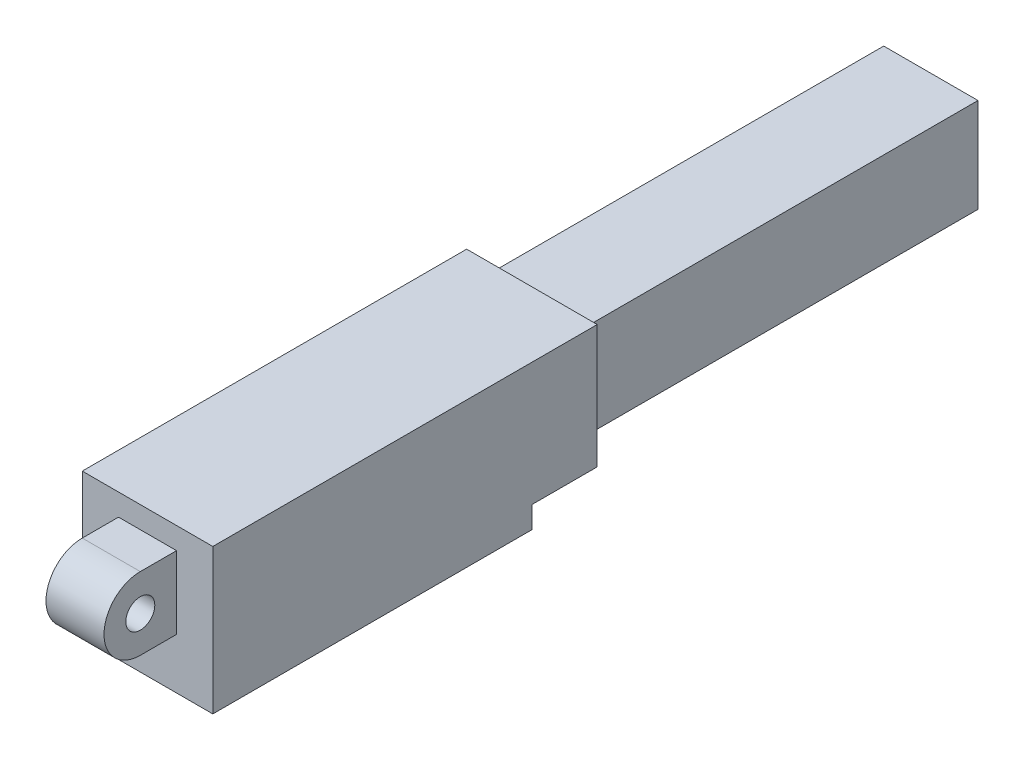
ISO-10303-21;
HEADER;
FILE_DESCRIPTION(('STEP AP214'),'2;1');
FILE_NAME('part.step','',(''),(''),'','','');
FILE_SCHEMA(('AUTOMOTIVE_DESIGN { 1 0 10303 214 1 1 1 1 }'));
ENDSEC;
DATA;
#1=APPLICATION_CONTEXT('core data for automotive mechanical design processes');
#2=APPLICATION_PROTOCOL_DEFINITION('international standard','automotive_design',2000,#1);
#3=PRODUCT_CONTEXT('',#1,'mechanical');
#4=PRODUCT('Part','Part','',(#3));
#5=PRODUCT_RELATED_PRODUCT_CATEGORY('part','',(#4));
#6=PRODUCT_DEFINITION_FORMATION('','',#4);
#7=PRODUCT_DEFINITION_CONTEXT('part definition',#1,'design');
#8=PRODUCT_DEFINITION('design','',#6,#7);
#9=PRODUCT_DEFINITION_SHAPE('','',#8);
#10=(LENGTH_UNIT() NAMED_UNIT(*) SI_UNIT(.MILLI.,.METRE.));
#11=(NAMED_UNIT(*) PLANE_ANGLE_UNIT() SI_UNIT($,.RADIAN.));
#12=(NAMED_UNIT(*) SI_UNIT($,.STERADIAN.) SOLID_ANGLE_UNIT());
#13=UNCERTAINTY_MEASURE_WITH_UNIT(LENGTH_MEASURE(1.E-05),#10,'distance_accuracy_value','');
#14=(GEOMETRIC_REPRESENTATION_CONTEXT(3) GLOBAL_UNCERTAINTY_ASSIGNED_CONTEXT((#13)) GLOBAL_UNIT_ASSIGNED_CONTEXT((#10,
#11,#12)) REPRESENTATION_CONTEXT('',''));
#15=CARTESIAN_POINT('',(0.,0.,0.));
#16=DIRECTION('',(0.,0.,1.));
#17=DIRECTION('',(1.,0.,0.));
#18=AXIS2_PLACEMENT_3D('',#15,#16,#17);
#19=CARTESIAN_POINT('',(9.,10.,-26.5));
#20=DIRECTION('',(0.,0.,1.));
#21=DIRECTION('',(0.,-1.,0.));
#22=AXIS2_PLACEMENT_3D('',#19,#20,#21);
#23=PLANE('',#22);
#24=DIRECTION('',(0.,1.,0.));
#25=VECTOR('',#24,1.);
#26=CARTESIAN_POINT('',(-9.,10.,-26.5));
#27=LINE('',#26,#25);
#28=CARTESIAN_POINT('',(-9.,-6.99999999999999,-26.5));
#29=VERTEX_POINT('',#28);
#30=CARTESIAN_POINT('',(-9.,10.,-26.5));
#31=VERTEX_POINT('',#30);
#32=EDGE_CURVE('E223',#29,#31,#27,.T.);
#33=ORIENTED_EDGE('',*,*,#32,.T.);
#34=DIRECTION('',(-1.,0.,0.));
#35=VECTOR('',#34,1.);
#36=CARTESIAN_POINT('',(9.,10.,-26.5));
#37=LINE('',#36,#35);
#38=CARTESIAN_POINT('',(9.,10.,-26.5));
#39=VERTEX_POINT('',#38);
#40=EDGE_CURVE('E228',#39,#31,#37,.T.);
#41=ORIENTED_EDGE('',*,*,#40,.F.);
#42=DIRECTION('',(0.,1.,0.));
#43=VECTOR('',#42,1.);
#44=CARTESIAN_POINT('',(9.,10.,-26.5));
#45=LINE('',#44,#43);
#46=CARTESIAN_POINT('',(9.,-6.99999999999999,-26.5));
#47=VERTEX_POINT('',#46);
#48=EDGE_CURVE('E210',#47,#39,#45,.T.);
#49=ORIENTED_EDGE('',*,*,#48,.F.);
#50=DIRECTION('',(-1.,0.,0.));
#51=VECTOR('',#50,1.);
#52=CARTESIAN_POINT('',(9.,-6.99999999999999,-26.5));
#53=LINE('',#52,#51);
#54=EDGE_CURVE('E231',#47,#29,#53,.T.);
#55=ORIENTED_EDGE('',*,*,#54,.T.);
#56=EDGE_LOOP('',(#33,#41,#49,#55));
#57=FACE_BOUND('',#56,.T.);
#58=DIRECTION('',(0.,1.,0.));
#59=VECTOR('',#58,1.);
#60=CARTESIAN_POINT('',(-6.5,-4.99999999999999,-26.5));
#61=LINE('',#60,#59);
#62=CARTESIAN_POINT('',(-6.5,-4.99999999999999,-26.5));
#63=VERTEX_POINT('',#62);
#64=CARTESIAN_POINT('',(-6.5,8.,-26.5));
#65=VERTEX_POINT('',#64);
#66=EDGE_CURVE('E51',#63,#65,#61,.T.);
#67=ORIENTED_EDGE('',*,*,#66,.F.);
#68=DIRECTION('',(-1.,0.,0.));
#69=VECTOR('',#68,1.);
#70=CARTESIAN_POINT('',(6.5,-4.99999999999999,-26.5));
#71=LINE('',#70,#69);
#72=CARTESIAN_POINT('',(6.5,-4.99999999999999,-26.5));
#73=VERTEX_POINT('',#72);
#74=EDGE_CURVE('E55',#73,#63,#71,.T.);
#75=ORIENTED_EDGE('',*,*,#74,.F.);
#76=DIRECTION('',(0.,-1.,0.));
#77=VECTOR('',#76,1.);
#78=CARTESIAN_POINT('',(6.5,-4.99999999999999,-26.5));
#79=LINE('',#78,#77);
#80=CARTESIAN_POINT('',(6.5,8.,-26.5));
#81=VERTEX_POINT('',#80);
#82=EDGE_CURVE('E433',#81,#73,#79,.T.);
#83=ORIENTED_EDGE('',*,*,#82,.F.);
#84=DIRECTION('',(1.,0.,0.));
#85=VECTOR('',#84,1.);
#86=CARTESIAN_POINT('',(6.5,8.,-26.5));
#87=LINE('',#86,#85);
#88=EDGE_CURVE('E439',#65,#81,#87,.T.);
#89=ORIENTED_EDGE('',*,*,#88,.F.);
#90=EDGE_LOOP('',(#67,#75,#83,#89));
#91=FACE_BOUND('',#90,.T.);
#92=ADVANCED_FACE('F36',(#57,#91),#23,.F.);
#93=CARTESIAN_POINT('',(9.,-10.,26.5));
#94=DIRECTION('',(0.,0.,-1.));
#95=DIRECTION('',(-1.,0.,0.));
#96=AXIS2_PLACEMENT_3D('',#93,#94,#95);
#97=PLANE('',#96);
#98=DIRECTION('',(-1.,0.,0.));
#99=VECTOR('',#98,1.);
#100=CARTESIAN_POINT('',(4.,-3.,26.5));
#101=LINE('',#100,#99);
#102=CARTESIAN_POINT('',(4.,-3.,26.5));
#103=VERTEX_POINT('',#102);
#104=CARTESIAN_POINT('',(-4.,-3.,26.5));
#105=VERTEX_POINT('',#104);
#106=EDGE_CURVE('E193',#103,#105,#101,.T.);
#107=ORIENTED_EDGE('',*,*,#106,.T.);
#108=DIRECTION('',(0.,1.,0.));
#109=VECTOR('',#108,1.);
#110=CARTESIAN_POINT('',(-4.,7.,26.5));
#111=LINE('',#110,#109);
#112=CARTESIAN_POINT('',(-4.,7.,26.5));
#113=VERTEX_POINT('',#112);
#114=EDGE_CURVE('E185',#105,#113,#111,.T.);
#115=ORIENTED_EDGE('',*,*,#114,.T.);
#116=DIRECTION('',(-1.,0.,0.));
#117=VECTOR('',#116,1.);
#118=CARTESIAN_POINT('',(4.,7.,26.5));
#119=LINE('',#118,#117);
#120=CARTESIAN_POINT('',(4.,7.,26.5));
#121=VERTEX_POINT('',#120);
#122=EDGE_CURVE('E191',#121,#113,#119,.T.);
#123=ORIENTED_EDGE('',*,*,#122,.F.);
#124=DIRECTION('',(0.,1.,0.));
#125=VECTOR('',#124,1.);
#126=CARTESIAN_POINT('',(4.,7.,26.5));
#127=LINE('',#126,#125);
#128=EDGE_CURVE('E175',#103,#121,#127,.T.);
#129=ORIENTED_EDGE('',*,*,#128,.F.);
#130=EDGE_LOOP('',(#107,#115,#123,#129));
#131=FACE_BOUND('',#130,.T.);
#132=DIRECTION('',(0.,-1.,0.));
#133=VECTOR('',#132,1.);
#134=CARTESIAN_POINT('',(-9.,-10.,26.5));
#135=LINE('',#134,#133);
#136=CARTESIAN_POINT('',(-9.,10.,26.5));
#137=VERTEX_POINT('',#136);
#138=CARTESIAN_POINT('',(-9.,-10.,26.5));
#139=VERTEX_POINT('',#138);
#140=EDGE_CURVE('E199',#137,#139,#135,.T.);
#141=ORIENTED_EDGE('',*,*,#140,.T.);
#142=DIRECTION('',(-1.,0.,0.));
#143=VECTOR('',#142,1.);
#144=CARTESIAN_POINT('',(9.,-10.,26.5));
#145=LINE('',#144,#143);
#146=CARTESIAN_POINT('',(9.,-10.,26.5));
#147=VERTEX_POINT('',#146);
#148=EDGE_CURVE('E11',#147,#139,#145,.T.);
#149=ORIENTED_EDGE('',*,*,#148,.F.);
#150=DIRECTION('',(0.,-1.,0.));
#151=VECTOR('',#150,1.);
#152=CARTESIAN_POINT('',(9.,-10.,26.5));
#153=LINE('',#152,#151);
#154=CARTESIAN_POINT('',(9.,10.,26.5));
#155=VERTEX_POINT('',#154);
#156=EDGE_CURVE('E200',#155,#147,#153,.T.);
#157=ORIENTED_EDGE('',*,*,#156,.F.);
#158=DIRECTION('',(-1.,0.,0.));
#159=VECTOR('',#158,1.);
#160=CARTESIAN_POINT('',(9.,10.,26.5));
#161=LINE('',#160,#159);
#162=EDGE_CURVE('E214',#155,#137,#161,.T.);
#163=ORIENTED_EDGE('',*,*,#162,.T.);
#164=EDGE_LOOP('',(#141,#149,#157,#163));
#165=FACE_BOUND('',#164,.T.);
#166=ADVANCED_FACE('F38',(#131,#165),#97,.F.);
#167=CARTESIAN_POINT('',(9.,-9.99999999999999,-17.5));
#168=DIRECTION('',(0.,1.,0.));
#169=DIRECTION('',(0.,0.,1.));
#170=AXIS2_PLACEMENT_3D('',#167,#168,#169);
#171=PLANE('',#170);
#172=DIRECTION('',(0.,0.,-1.));
#173=VECTOR('',#172,1.);
#174=CARTESIAN_POINT('',(-9.,-9.99999999999999,-17.5));
#175=LINE('',#174,#173);
#176=CARTESIAN_POINT('',(-9.,-9.99999999999999,-17.5));
#177=VERTEX_POINT('',#176);
#178=EDGE_CURVE('E217',#139,#177,#175,.T.);
#179=ORIENTED_EDGE('',*,*,#178,.T.);
#180=DIRECTION('',(-1.,0.,0.));
#181=VECTOR('',#180,1.);
#182=CARTESIAN_POINT('',(9.,-9.99999999999999,-17.5));
#183=LINE('',#182,#181);
#184=CARTESIAN_POINT('',(9.,-9.99999999999999,-17.5));
#185=VERTEX_POINT('',#184);
#186=EDGE_CURVE('E44',#185,#177,#183,.T.);
#187=ORIENTED_EDGE('',*,*,#186,.F.);
#188=DIRECTION('',(0.,0.,-1.));
#189=VECTOR('',#188,1.);
#190=CARTESIAN_POINT('',(9.,-9.99999999999999,-17.5));
#191=LINE('',#190,#189);
#192=EDGE_CURVE('E203',#147,#185,#191,.T.);
#193=ORIENTED_EDGE('',*,*,#192,.F.);
#194=ORIENTED_EDGE('',*,*,#148,.T.);
#195=EDGE_LOOP('',(#179,#187,#193,#194));
#196=FACE_BOUND('',#195,.T.);
#197=ADVANCED_FACE('F263',(#196),#171,.F.);
#198=CARTESIAN_POINT('',(9.,-6.99999999999999,-17.5));
#199=DIRECTION('',(0.,0.,1.));
#200=DIRECTION('',(1.,0.,0.));
#201=AXIS2_PLACEMENT_3D('',#198,#199,#200);
#202=PLANE('',#201);
#203=DIRECTION('',(0.,1.,0.));
#204=VECTOR('',#203,1.);
#205=CARTESIAN_POINT('',(-9.,-6.99999999999999,-17.5));
#206=LINE('',#205,#204);
#207=CARTESIAN_POINT('',(-9.,-6.99999999999999,-17.5));
#208=VERTEX_POINT('',#207);
#209=EDGE_CURVE('E219',#177,#208,#206,.T.);
#210=ORIENTED_EDGE('',*,*,#209,.T.);
#211=DIRECTION('',(-1.,0.,0.));
#212=VECTOR('',#211,1.);
#213=CARTESIAN_POINT('',(9.,-6.99999999999999,-17.5));
#214=LINE('',#213,#212);
#215=CARTESIAN_POINT('',(9.,-6.99999999999999,-17.5));
#216=VERTEX_POINT('',#215);
#217=EDGE_CURVE('E234',#216,#208,#214,.T.);
#218=ORIENTED_EDGE('',*,*,#217,.F.);
#219=DIRECTION('',(0.,1.,0.));
#220=VECTOR('',#219,1.);
#221=CARTESIAN_POINT('',(9.,-6.99999999999999,-17.5));
#222=LINE('',#221,#220);
#223=EDGE_CURVE('E206',#185,#216,#222,.T.);
#224=ORIENTED_EDGE('',*,*,#223,.F.);
#225=ORIENTED_EDGE('',*,*,#186,.T.);
#226=EDGE_LOOP('',(#210,#218,#224,#225));
#227=FACE_BOUND('',#226,.T.);
#228=ADVANCED_FACE('F241',(#227),#202,.F.);
#229=CARTESIAN_POINT('',(9.,-6.99999999999999,-26.5));
#230=DIRECTION('',(0.,1.,0.));
#231=DIRECTION('',(0.,0.,1.));
#232=AXIS2_PLACEMENT_3D('',#229,#230,#231);
#233=PLANE('',#232);
#234=DIRECTION('',(0.,0.,-1.));
#235=VECTOR('',#234,1.);
#236=CARTESIAN_POINT('',(-9.,-6.99999999999999,-26.5));
#237=LINE('',#236,#235);
#238=EDGE_CURVE('E221',#208,#29,#237,.T.);
#239=ORIENTED_EDGE('',*,*,#238,.T.);
#240=ORIENTED_EDGE('',*,*,#54,.F.);
#241=DIRECTION('',(0.,0.,-1.));
#242=VECTOR('',#241,1.);
#243=CARTESIAN_POINT('',(9.,-6.99999999999999,-26.5));
#244=LINE('',#243,#242);
#245=EDGE_CURVE('E208',#216,#47,#244,.T.);
#246=ORIENTED_EDGE('',*,*,#245,.F.);
#247=ORIENTED_EDGE('',*,*,#217,.T.);
#248=EDGE_LOOP('',(#239,#240,#246,#247));
#249=FACE_BOUND('',#248,.T.);
#250=ADVANCED_FACE('F252',(#249),#233,.F.);
#251=CARTESIAN_POINT('',(9.,10.,26.5));
#252=DIRECTION('',(0.,-1.,0.));
#253=DIRECTION('',(0.,0.,-1.));
#254=AXIS2_PLACEMENT_3D('',#251,#252,#253);
#255=PLANE('',#254);
#256=DIRECTION('',(0.,0.,1.));
#257=VECTOR('',#256,1.);
#258=CARTESIAN_POINT('',(-9.,10.,26.5));
#259=LINE('',#258,#257);
#260=EDGE_CURVE('E204',#31,#137,#259,.T.);
#261=ORIENTED_EDGE('',*,*,#260,.T.);
#262=ORIENTED_EDGE('',*,*,#162,.F.);
#263=DIRECTION('',(0.,0.,1.));
#264=VECTOR('',#263,1.);
#265=CARTESIAN_POINT('',(9.,10.,26.5));
#266=LINE('',#265,#264);
#267=EDGE_CURVE('E212',#39,#155,#266,.T.);
#268=ORIENTED_EDGE('',*,*,#267,.F.);
#269=ORIENTED_EDGE('',*,*,#40,.T.);
#270=EDGE_LOOP('',(#261,#262,#268,#269));
#271=FACE_BOUND('',#270,.T.);
#272=ADVANCED_FACE('F266',(#271),#255,.F.);
#273=CARTESIAN_POINT('',(9.,0.,0.));
#274=DIRECTION('',(-1.,0.,0.));
#275=DIRECTION('',(0.,0.,1.));
#276=AXIS2_PLACEMENT_3D('',#273,#274,#275);
#277=PLANE('',#276);
#278=ORIENTED_EDGE('',*,*,#156,.T.);
#279=ORIENTED_EDGE('',*,*,#192,.T.);
#280=ORIENTED_EDGE('',*,*,#223,.T.);
#281=ORIENTED_EDGE('',*,*,#245,.T.);
#282=ORIENTED_EDGE('',*,*,#48,.T.);
#283=ORIENTED_EDGE('',*,*,#267,.T.);
#284=EDGE_LOOP('',(#278,#279,#280,#281,#282,#283));
#285=FACE_BOUND('',#284,.T.);
#286=ADVANCED_FACE('F259',(#285),#277,.F.);
#287=CARTESIAN_POINT('',(-9.,0.,0.));
#288=DIRECTION('',(-1.,0.,0.));
#289=DIRECTION('',(0.,0.,1.));
#290=AXIS2_PLACEMENT_3D('',#287,#288,#289);
#291=PLANE('',#290);
#292=ORIENTED_EDGE('',*,*,#140,.F.);
#293=ORIENTED_EDGE('',*,*,#260,.F.);
#294=ORIENTED_EDGE('',*,*,#32,.F.);
#295=ORIENTED_EDGE('',*,*,#238,.F.);
#296=ORIENTED_EDGE('',*,*,#209,.F.);
#297=ORIENTED_EDGE('',*,*,#178,.F.);
#298=EDGE_LOOP('',(#292,#293,#294,#295,#296,#297));
#299=FACE_BOUND('',#298,.T.);
#300=ADVANCED_FACE('F247',(#299),#291,.T.);
#301=CARTESIAN_POINT('',(4.,2.,31.5));
#302=DIRECTION('',(1.,0.,0.));
#303=DIRECTION('',(0.,0.,-1.));
#304=AXIS2_PLACEMENT_3D('',#301,#302,#303);
#305=PLANE('',#304);
#306=CARTESIAN_POINT('',(4.,2.,31.5));
#307=DIRECTION('',(1.,0.,0.));
#308=DIRECTION('',(0.,0.,-1.));
#309=AXIS2_PLACEMENT_3D('',#306,#307,#308);
#310=CIRCLE('',#309,5.);
#311=CARTESIAN_POINT('',(4.,7.,31.5));
#312=VERTEX_POINT('',#311);
#313=CARTESIAN_POINT('',(4.,-3.,31.5));
#314=VERTEX_POINT('',#313);
#315=EDGE_CURVE('E169',#312,#314,#310,.T.);
#316=ORIENTED_EDGE('',*,*,#315,.T.);
#317=DIRECTION('',(0.,0.,-1.));
#318=VECTOR('',#317,1.);
#319=CARTESIAN_POINT('',(4.,-3.,26.5));
#320=LINE('',#319,#318);
#321=EDGE_CURVE('E172',#314,#103,#320,.T.);
#322=ORIENTED_EDGE('',*,*,#321,.T.);
#323=ORIENTED_EDGE('',*,*,#128,.T.);
#324=DIRECTION('',(0.,0.,1.));
#325=VECTOR('',#324,1.);
#326=CARTESIAN_POINT('',(4.,7.,31.5));
#327=LINE('',#326,#325);
#328=EDGE_CURVE('E177',#121,#312,#327,.T.);
#329=ORIENTED_EDGE('',*,*,#328,.T.);
#330=EDGE_LOOP('',(#316,#322,#323,#329));
#331=FACE_BOUND('',#330,.T.);
#332=CARTESIAN_POINT('',(4.,2.,31.5));
#333=DIRECTION('',(1.,0.,0.));
#334=DIRECTION('',(0.,0.,-1.));
#335=AXIS2_PLACEMENT_3D('',#332,#333,#334);
#336=CIRCLE('',#335,2.);
#337=CARTESIAN_POINT('',(4.,2.,29.5));
#338=VERTEX_POINT('',#337);
#339=EDGE_CURVE('E160',#338,#338,#336,.T.);
#340=ORIENTED_EDGE('',*,*,#339,.F.);
#341=EDGE_LOOP('',(#340));
#342=FACE_BOUND('',#341,.T.);
#343=ADVANCED_FACE('F315',(#331,#342),#305,.T.);
#344=CARTESIAN_POINT('',(-4.,2.,31.5));
#345=DIRECTION('',(1.,0.,0.));
#346=DIRECTION('',(0.,0.,-1.));
#347=AXIS2_PLACEMENT_3D('',#344,#345,#346);
#348=PLANE('',#347);
#349=CARTESIAN_POINT('',(-4.,2.,31.5));
#350=DIRECTION('',(1.,0.,0.));
#351=DIRECTION('',(0.,0.,-1.));
#352=AXIS2_PLACEMENT_3D('',#349,#350,#351);
#353=CIRCLE('',#352,5.);
#354=CARTESIAN_POINT('',(-4.,7.,31.5));
#355=VERTEX_POINT('',#354);
#356=CARTESIAN_POINT('',(-4.,-3.,31.5));
#357=VERTEX_POINT('',#356);
#358=EDGE_CURVE('E167',#355,#357,#353,.T.);
#359=ORIENTED_EDGE('',*,*,#358,.F.);
#360=DIRECTION('',(0.,0.,1.));
#361=VECTOR('',#360,1.);
#362=CARTESIAN_POINT('',(-4.,7.,31.5));
#363=LINE('',#362,#361);
#364=EDGE_CURVE('E173',#113,#355,#363,.T.);
#365=ORIENTED_EDGE('',*,*,#364,.F.);
#366=ORIENTED_EDGE('',*,*,#114,.F.);
#367=DIRECTION('',(0.,0.,-1.));
#368=VECTOR('',#367,1.);
#369=CARTESIAN_POINT('',(-4.,-3.,26.5));
#370=LINE('',#369,#368);
#371=EDGE_CURVE('E182',#357,#105,#370,.T.);
#372=ORIENTED_EDGE('',*,*,#371,.F.);
#373=EDGE_LOOP('',(#359,#365,#366,#372));
#374=FACE_BOUND('',#373,.T.);
#375=CARTESIAN_POINT('',(-4.,2.,31.5));
#376=DIRECTION('',(1.,0.,0.));
#377=DIRECTION('',(0.,0.,-1.));
#378=AXIS2_PLACEMENT_3D('',#375,#376,#377);
#379=CIRCLE('',#378,2.);
#380=CARTESIAN_POINT('',(-4.,2.,29.5));
#381=VERTEX_POINT('',#380);
#382=EDGE_CURVE('E157',#381,#381,#379,.T.);
#383=ORIENTED_EDGE('',*,*,#382,.T.);
#384=EDGE_LOOP('',(#383));
#385=FACE_BOUND('',#384,.T.);
#386=ADVANCED_FACE('F328',(#374,#385),#348,.F.);
#387=CARTESIAN_POINT('',(4.,2.,31.5));
#388=DIRECTION('',(-1.,0.,0.));
#389=DIRECTION('',(0.,0.,1.));
#390=AXIS2_PLACEMENT_3D('',#387,#388,#389);
#391=CYLINDRICAL_SURFACE('',#390,5.);
#392=ORIENTED_EDGE('',*,*,#358,.T.);
#393=DIRECTION('',(-1.,0.,0.));
#394=VECTOR('',#393,1.);
#395=CARTESIAN_POINT('',(4.,-3.,31.5));
#396=LINE('',#395,#394);
#397=EDGE_CURVE('E196',#314,#357,#396,.T.);
#398=ORIENTED_EDGE('',*,*,#397,.F.);
#399=ORIENTED_EDGE('',*,*,#315,.F.);
#400=DIRECTION('',(-1.,0.,0.));
#401=VECTOR('',#400,1.);
#402=CARTESIAN_POINT('',(4.,7.,31.5));
#403=LINE('',#402,#401);
#404=EDGE_CURVE('E179',#312,#355,#403,.T.);
#405=ORIENTED_EDGE('',*,*,#404,.T.);
#406=EDGE_LOOP('',(#392,#398,#399,#405));
#407=FACE_BOUND('',#406,.T.);
#408=ADVANCED_FACE('F338',(#407),#391,.T.);
#409=CARTESIAN_POINT('',(4.,-3.,26.5));
#410=DIRECTION('',(0.,1.,0.));
#411=DIRECTION('',(0.,0.,1.));
#412=AXIS2_PLACEMENT_3D('',#409,#410,#411);
#413=PLANE('',#412);
#414=ORIENTED_EDGE('',*,*,#371,.T.);
#415=ORIENTED_EDGE('',*,*,#106,.F.);
#416=ORIENTED_EDGE('',*,*,#321,.F.);
#417=ORIENTED_EDGE('',*,*,#397,.T.);
#418=EDGE_LOOP('',(#414,#415,#416,#417));
#419=FACE_BOUND('',#418,.T.);
#420=ADVANCED_FACE('F348',(#419),#413,.F.);
#421=CARTESIAN_POINT('',(4.,7.,31.5));
#422=DIRECTION('',(0.,-1.,0.));
#423=DIRECTION('',(0.,0.,-1.));
#424=AXIS2_PLACEMENT_3D('',#421,#422,#423);
#425=PLANE('',#424);
#426=ORIENTED_EDGE('',*,*,#364,.T.);
#427=ORIENTED_EDGE('',*,*,#404,.F.);
#428=ORIENTED_EDGE('',*,*,#328,.F.);
#429=ORIENTED_EDGE('',*,*,#122,.T.);
#430=EDGE_LOOP('',(#426,#427,#428,#429));
#431=FACE_BOUND('',#430,.T.);
#432=ADVANCED_FACE('F358',(#431),#425,.F.);
#433=CARTESIAN_POINT('',(4.,2.,31.5));
#434=DIRECTION('',(-1.,0.,0.));
#435=DIRECTION('',(0.,0.,1.));
#436=AXIS2_PLACEMENT_3D('',#433,#434,#435);
#437=CYLINDRICAL_SURFACE('',#436,2.);
#438=ORIENTED_EDGE('',*,*,#339,.T.);
#439=EDGE_LOOP('',(#438));
#440=FACE_BOUND('',#439,.T.);
#441=ORIENTED_EDGE('',*,*,#382,.F.);
#442=EDGE_LOOP('',(#441));
#443=FACE_BOUND('',#442,.T.);
#444=ADVANCED_FACE('F368',(#440,#443),#437,.F.);
#445=CARTESIAN_POINT('',(-6.5,-4.99999999999998,-81.5));
#446=DIRECTION('',(1.,0.,0.));
#447=DIRECTION('',(0.,0.,-1.));
#448=AXIS2_PLACEMENT_3D('',#445,#446,#447);
#449=PLANE('',#448);
#450=ORIENTED_EDGE('',*,*,#66,.T.);
#451=DIRECTION('',(0.,0.,1.));
#452=VECTOR('',#451,1.);
#453=CARTESIAN_POINT('',(-6.5,8.00000000000001,-81.5));
#454=LINE('',#453,#452);
#455=CARTESIAN_POINT('',(-6.5,8.00000000000001,-81.5));
#456=VERTEX_POINT('',#455);
#457=EDGE_CURVE('E140',#456,#65,#454,.T.);
#458=ORIENTED_EDGE('',*,*,#457,.F.);
#459=DIRECTION('',(0.,1.,0.));
#460=VECTOR('',#459,1.);
#461=CARTESIAN_POINT('',(-6.5,-4.99999999999998,-81.5));
#462=LINE('',#461,#460);
#463=CARTESIAN_POINT('',(-6.5,-4.99999999999998,-81.5));
#464=VERTEX_POINT('',#463);
#465=EDGE_CURVE('E146',#464,#456,#462,.T.);
#466=ORIENTED_EDGE('',*,*,#465,.F.);
#467=DIRECTION('',(0.,0.,1.));
#468=VECTOR('',#467,1.);
#469=CARTESIAN_POINT('',(-6.5,-4.99999999999998,-81.5));
#470=LINE('',#469,#468);
#471=EDGE_CURVE('E431',#464,#63,#470,.T.);
#472=ORIENTED_EDGE('',*,*,#471,.T.);
#473=EDGE_LOOP('',(#450,#458,#466,#472));
#474=FACE_BOUND('',#473,.T.);
#475=ADVANCED_FACE('F156',(#474),#449,.F.);
#476=CARTESIAN_POINT('',(6.5,8.00000000000001,-81.5));
#477=DIRECTION('',(0.,-1.,0.));
#478=DIRECTION('',(0.,0.,-1.));
#479=AXIS2_PLACEMENT_3D('',#476,#477,#478);
#480=PLANE('',#479);
#481=ORIENTED_EDGE('',*,*,#88,.T.);
#482=DIRECTION('',(0.,0.,1.));
#483=VECTOR('',#482,1.);
#484=CARTESIAN_POINT('',(6.5,8.00000000000001,-81.5));
#485=LINE('',#484,#483);
#486=CARTESIAN_POINT('',(6.5,8.00000000000001,-81.5));
#487=VERTEX_POINT('',#486);
#488=EDGE_CURVE('E142',#487,#81,#485,.T.);
#489=ORIENTED_EDGE('',*,*,#488,.F.);
#490=DIRECTION('',(1.,0.,0.));
#491=VECTOR('',#490,1.);
#492=CARTESIAN_POINT('',(6.5,8.00000000000001,-81.5));
#493=LINE('',#492,#491);
#494=EDGE_CURVE('E135',#456,#487,#493,.T.);
#495=ORIENTED_EDGE('',*,*,#494,.F.);
#496=ORIENTED_EDGE('',*,*,#457,.T.);
#497=EDGE_LOOP('',(#481,#489,#495,#496));
#498=FACE_BOUND('',#497,.T.);
#499=ADVANCED_FACE('F138',(#498),#480,.F.);
#500=CARTESIAN_POINT('',(6.5,-4.99999999999998,-81.5));
#501=DIRECTION('',(-1.,0.,0.));
#502=DIRECTION('',(0.,-1.,0.));
#503=AXIS2_PLACEMENT_3D('',#500,#501,#502);
#504=PLANE('',#503);
#505=ORIENTED_EDGE('',*,*,#82,.T.);
#506=DIRECTION('',(0.,0.,1.));
#507=VECTOR('',#506,1.);
#508=CARTESIAN_POINT('',(6.5,-4.99999999999998,-81.5));
#509=LINE('',#508,#507);
#510=CARTESIAN_POINT('',(6.5,-4.99999999999998,-81.5));
#511=VERTEX_POINT('',#510);
#512=EDGE_CURVE('E162',#511,#73,#509,.T.);
#513=ORIENTED_EDGE('',*,*,#512,.F.);
#514=DIRECTION('',(0.,-1.,0.));
#515=VECTOR('',#514,1.);
#516=CARTESIAN_POINT('',(6.5,-4.99999999999998,-81.5));
#517=LINE('',#516,#515);
#518=EDGE_CURVE('E145',#487,#511,#517,.T.);
#519=ORIENTED_EDGE('',*,*,#518,.F.);
#520=ORIENTED_EDGE('',*,*,#488,.T.);
#521=EDGE_LOOP('',(#505,#513,#519,#520));
#522=FACE_BOUND('',#521,.T.);
#523=ADVANCED_FACE('F399',(#522),#504,.F.);
#524=CARTESIAN_POINT('',(6.5,-4.99999999999998,-81.5));
#525=DIRECTION('',(0.,1.,0.));
#526=DIRECTION('',(0.,0.,1.));
#527=AXIS2_PLACEMENT_3D('',#524,#525,#526);
#528=PLANE('',#527);
#529=ORIENTED_EDGE('',*,*,#74,.T.);
#530=ORIENTED_EDGE('',*,*,#471,.F.);
#531=DIRECTION('',(-1.,0.,0.));
#532=VECTOR('',#531,1.);
#533=CARTESIAN_POINT('',(6.5,-4.99999999999998,-81.5));
#534=LINE('',#533,#532);
#535=EDGE_CURVE('E151',#511,#464,#534,.T.);
#536=ORIENTED_EDGE('',*,*,#535,.F.);
#537=ORIENTED_EDGE('',*,*,#512,.T.);
#538=EDGE_LOOP('',(#529,#530,#536,#537));
#539=FACE_BOUND('',#538,.T.);
#540=ADVANCED_FACE('F408',(#539),#528,.F.);
#541=CARTESIAN_POINT('',(0.,0.,-81.5));
#542=DIRECTION('',(0.,0.,1.));
#543=DIRECTION('',(1.,0.,0.));
#544=AXIS2_PLACEMENT_3D('',#541,#542,#543);
#545=PLANE('',#544);
#546=ORIENTED_EDGE('',*,*,#465,.T.);
#547=ORIENTED_EDGE('',*,*,#494,.T.);
#548=ORIENTED_EDGE('',*,*,#518,.T.);
#549=ORIENTED_EDGE('',*,*,#535,.T.);
#550=EDGE_LOOP('',(#546,#547,#548,#549));
#551=FACE_BOUND('',#550,.T.);
#552=ADVANCED_FACE('F149',(#551),#545,.F.);
#553=CLOSED_SHELL('',(#92,#166,#197,#228,#250,#272,#286,#300,#343,#386,#408,#420,#432,#444,#475,
#499,#523,#540,#552));
#554=MANIFOLD_SOLID_BREP('B2',#553);
#555=ADVANCED_BREP_SHAPE_REPRESENTATION('',(#18,#554),#14);
#556=SHAPE_DEFINITION_REPRESENTATION(#9,#555);
ENDSEC;
END-ISO-10303-21;
